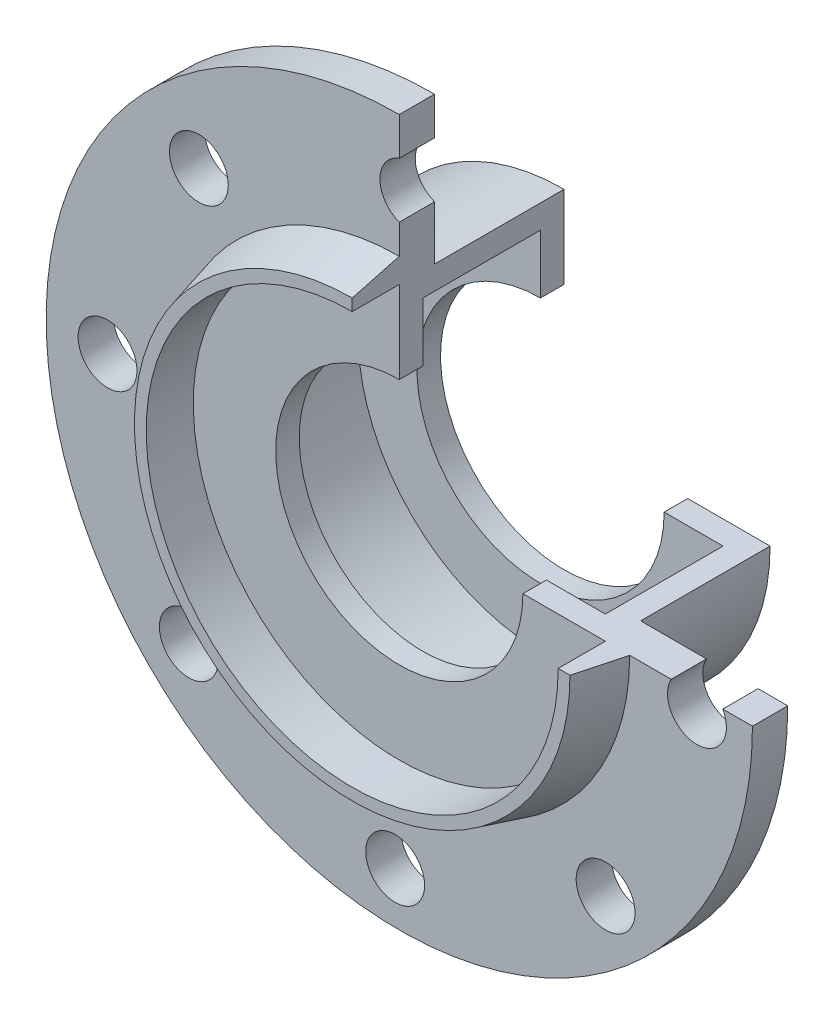
ISO-10303-21;
HEADER;
FILE_DESCRIPTION(('STEP AP214'),'2;1');
FILE_NAME('part.step','',(''),(''),'','','');
FILE_SCHEMA(('AUTOMOTIVE_DESIGN { 1 0 10303 214 1 1 1 1 }'));
ENDSEC;
DATA;
#1=APPLICATION_CONTEXT('core data for automotive mechanical design processes');
#2=APPLICATION_PROTOCOL_DEFINITION('international standard','automotive_design',2000,#1);
#3=PRODUCT_CONTEXT('',#1,'mechanical');
#4=PRODUCT('Part','Part','',(#3));
#5=PRODUCT_RELATED_PRODUCT_CATEGORY('part','',(#4));
#6=PRODUCT_DEFINITION_FORMATION('','',#4);
#7=PRODUCT_DEFINITION_CONTEXT('part definition',#1,'design');
#8=PRODUCT_DEFINITION('design','',#6,#7);
#9=PRODUCT_DEFINITION_SHAPE('','',#8);
#10=(LENGTH_UNIT() NAMED_UNIT(*) SI_UNIT(.MILLI.,.METRE.));
#11=(NAMED_UNIT(*) PLANE_ANGLE_UNIT() SI_UNIT($,.RADIAN.));
#12=(NAMED_UNIT(*) SI_UNIT($,.STERADIAN.) SOLID_ANGLE_UNIT());
#13=UNCERTAINTY_MEASURE_WITH_UNIT(LENGTH_MEASURE(1.E-05),#10,'distance_accuracy_value','');
#14=(GEOMETRIC_REPRESENTATION_CONTEXT(3) GLOBAL_UNCERTAINTY_ASSIGNED_CONTEXT((#13)) GLOBAL_UNIT_ASSIGNED_CONTEXT((#10,
#11,#12)) REPRESENTATION_CONTEXT('',''));
#15=CARTESIAN_POINT('',(0.,0.,0.));
#16=DIRECTION('',(0.,0.,1.));
#17=DIRECTION('',(1.,0.,0.));
#18=AXIS2_PLACEMENT_3D('',#15,#16,#17);
#19=CARTESIAN_POINT('',(35.,-34.9999999999997,0.));
#20=DIRECTION('',(0.,-1.,0.));
#21=DIRECTION('',(0.,0.,-1.));
#22=AXIS2_PLACEMENT_3D('',#19,#20,#21);
#23=PLANE('',#22);
#24=DIRECTION('',(1.,0.,0.));
#25=VECTOR('',#24,1.);
#26=CARTESIAN_POINT('',(60.,-34.9999999999994,-6.));
#27=LINE('',#26,#25);
#28=CARTESIAN_POINT('',(54.9503322412324,-34.9999999999994,-6.));
#29=VERTEX_POINT('',#28);
#30=CARTESIAN_POINT('',(60.,-34.9999999999994,-6.));
#31=VERTEX_POINT('',#30);
#32=EDGE_CURVE('E223',#29,#31,#27,.T.);
#33=ORIENTED_EDGE('',*,*,#32,.F.);
#34=DIRECTION('',(0.,0.,1.));
#35=VECTOR('',#34,1.);
#36=CARTESIAN_POINT('',(54.9503322412324,-34.9999999999994,-8.));
#37=LINE('',#36,#35);
#38=CARTESIAN_POINT('',(54.9503322412324,-34.9999999999994,0.));
#39=VERTEX_POINT('',#38);
#40=EDGE_CURVE('E11',#29,#39,#37,.T.);
#41=ORIENTED_EDGE('',*,*,#40,.T.);
#42=DIRECTION('',(-1.,0.,0.));
#43=VECTOR('',#42,1.);
#44=CARTESIAN_POINT('',(39.143593539449,-34.9999999999996,0.));
#45=LINE('',#44,#43);
#46=CARTESIAN_POINT('',(60.,-34.9999999999994,0.));
#47=VERTEX_POINT('',#46);
#48=EDGE_CURVE('E231',#47,#39,#45,.T.);
#49=ORIENTED_EDGE('',*,*,#48,.F.);
#50=DIRECTION('',(0.,0.,1.));
#51=VECTOR('',#50,1.);
#52=CARTESIAN_POINT('',(60.,-34.9999999999994,0.));
#53=LINE('',#52,#51);
#54=EDGE_CURVE('E227',#31,#47,#53,.T.);
#55=ORIENTED_EDGE('',*,*,#54,.F.);
#56=EDGE_LOOP('',(#33,#41,#49,#55));
#57=FACE_BOUND('',#56,.T.);
#58=ADVANCED_FACE('F39',(#57),#23,.F.);
#59=CARTESIAN_POINT('',(0.,0.,0.));
#60=DIRECTION('',(1.,0.,0.));
#61=DIRECTION('',(0.,0.,-1.));
#62=AXIS2_PLACEMENT_3D('',#59,#60,#61);
#63=PLANE('',#62);
#64=DIRECTION('',(0.,0.,1.));
#65=VECTOR('',#64,1.);
#66=CARTESIAN_POINT('',(0.,18.5642417158442,-8.));
#67=LINE('',#66,#65);
#68=CARTESIAN_POINT('',(0.,18.5642417158442,-6.));
#69=VERTEX_POINT('',#68);
#70=CARTESIAN_POINT('',(0.,18.5642417158442,0.));
#71=VERTEX_POINT('',#70);
#72=EDGE_CURVE('E162',#69,#71,#67,.T.);
#73=ORIENTED_EDGE('',*,*,#72,.F.);
#74=DIRECTION('',(0.,1.,0.));
#75=VECTOR('',#74,1.);
#76=CARTESIAN_POINT('',(0.,25.,-6.));
#77=LINE('',#76,#75);
#78=CARTESIAN_POINT('',(0.,25.,-6.));
#79=VERTEX_POINT('',#78);
#80=EDGE_CURVE('E377',#69,#79,#77,.T.);
#81=ORIENTED_EDGE('',*,*,#80,.T.);
#82=DIRECTION('',(0.,0.,1.));
#83=VECTOR('',#82,1.);
#84=CARTESIAN_POINT('',(0.,25.,0.));
#85=LINE('',#84,#83);
#86=CARTESIAN_POINT('',(0.,25.,0.));
#87=VERTEX_POINT('',#86);
#88=EDGE_CURVE('E185',#79,#87,#85,.T.);
#89=ORIENTED_EDGE('',*,*,#88,.T.);
#90=DIRECTION('',(0.,-1.,0.));
#91=VECTOR('',#90,1.);
#92=CARTESIAN_POINT('',(0.,4.14359353944899,0.));
#93=LINE('',#92,#91);
#94=EDGE_CURVE('E176',#87,#71,#93,.T.);
#95=ORIENTED_EDGE('',*,*,#94,.T.);
#96=EDGE_LOOP('',(#73,#81,#89,#95));
#97=FACE_BOUND('',#96,.T.);
#98=ADVANCED_FACE('F183',(#97),#63,.T.);
#99=CARTESIAN_POINT('',(21.,-34.9999999999998,0.));
#100=DIRECTION('',(0.,0.,1.));
#101=DIRECTION('',(1.,0.,0.));
#102=AXIS2_PLACEMENT_3D('',#99,#100,#101);
#103=PLANE('',#102);
#104=CARTESIAN_POINT('',(0.,-35.,0.));
#105=DIRECTION('',(0.,0.,-1.));
#106=DIRECTION('',(-1.,0.,0.));
#107=AXIS2_PLACEMENT_3D('',#104,#105,#106);
#108=CIRCLE('',#107,21.);
#109=CARTESIAN_POINT('',(21.,-34.9999999999998,0.));
#110=VERTEX_POINT('',#109);
#111=CARTESIAN_POINT('',(0.,-14.,0.));
#112=VERTEX_POINT('',#111);
#113=EDGE_CURVE('E270',#110,#112,#108,.T.);
#114=ORIENTED_EDGE('',*,*,#113,.T.);
#115=DIRECTION('',(0.,-1.,0.));
#116=VECTOR('',#115,1.);
#117=CARTESIAN_POINT('',(0.,-14.,0.));
#118=LINE('',#117,#116);
#119=CARTESIAN_POINT('',(0.,0.,0.));
#120=VERTEX_POINT('',#119);
#121=EDGE_CURVE('E365',#120,#112,#118,.T.);
#122=ORIENTED_EDGE('',*,*,#121,.F.);
#123=CARTESIAN_POINT('',(0.,-35.,0.));
#124=DIRECTION('',(0.,0.,-1.));
#125=DIRECTION('',(-1.,0.,0.));
#126=AXIS2_PLACEMENT_3D('',#123,#124,#125);
#127=CIRCLE('',#126,35.);
#128=CARTESIAN_POINT('',(35.,-34.9999999999997,0.));
#129=VERTEX_POINT('',#128);
#130=EDGE_CURVE('E243',#129,#120,#127,.T.);
#131=ORIENTED_EDGE('',*,*,#130,.F.);
#132=DIRECTION('',(-1.,0.,0.));
#133=VECTOR('',#132,1.);
#134=CARTESIAN_POINT('',(21.,-34.9999999999998,0.));
#135=LINE('',#134,#133);
#136=EDGE_CURVE('E199',#129,#110,#135,.T.);
#137=ORIENTED_EDGE('',*,*,#136,.T.);
#138=EDGE_LOOP('',(#114,#122,#131,#137));
#139=FACE_BOUND('',#138,.T.);
#140=ADVANCED_FACE('F403',(#139),#103,.T.);
#141=CARTESIAN_POINT('',(0.,-35.,7.99999999999999));
#142=DIRECTION('',(0.,0.,-1.));
#143=DIRECTION('',(-1.,0.,0.));
#144=AXIS2_PLACEMENT_3D('',#141,#142,#143);
#145=CYLINDRICAL_SURFACE('',#144,21.);
#146=CARTESIAN_POINT('',(0.,-35.,-4.));
#147=DIRECTION('',(0.,0.,-1.));
#148=DIRECTION('',(-1.,0.,0.));
#149=AXIS2_PLACEMENT_3D('',#146,#147,#148);
#150=CIRCLE('',#149,21.);
#151=CARTESIAN_POINT('',(21.,-34.9999999999998,-4.));
#152=VERTEX_POINT('',#151);
#153=CARTESIAN_POINT('',(0.,-14.,-4.));
#154=VERTEX_POINT('',#153);
#155=EDGE_CURVE('E268',#152,#154,#150,.T.);
#156=ORIENTED_EDGE('',*,*,#155,.T.);
#157=DIRECTION('',(0.,0.,-1.));
#158=VECTOR('',#157,1.);
#159=CARTESIAN_POINT('',(0.,-14.,-4.));
#160=LINE('',#159,#158);
#161=EDGE_CURVE('E368',#112,#154,#160,.T.);
#162=ORIENTED_EDGE('',*,*,#161,.F.);
#163=ORIENTED_EDGE('',*,*,#113,.F.);
#164=DIRECTION('',(0.,0.,-1.));
#165=VECTOR('',#164,1.);
#166=CARTESIAN_POINT('',(21.,-34.9999999999998,-4.));
#167=LINE('',#166,#165);
#168=EDGE_CURVE('E202',#110,#152,#167,.T.);
#169=ORIENTED_EDGE('',*,*,#168,.T.);
#170=EDGE_LOOP('',(#156,#162,#163,#169));
#171=FACE_BOUND('',#170,.T.);
#172=ADVANCED_FACE('F41',(#171),#145,.F.);
#173=CARTESIAN_POINT('',(31.,-34.9999999999997,-4.));
#174=DIRECTION('',(0.,0.,-1.));
#175=DIRECTION('',(-1.,0.,0.));
#176=AXIS2_PLACEMENT_3D('',#173,#174,#175);
#177=PLANE('',#176);
#178=CARTESIAN_POINT('',(0.,-35.,-4.));
#179=DIRECTION('',(0.,0.,-1.));
#180=DIRECTION('',(-1.,0.,0.));
#181=AXIS2_PLACEMENT_3D('',#178,#179,#180);
#182=CIRCLE('',#181,31.);
#183=CARTESIAN_POINT('',(31.,-34.9999999999997,-4.));
#184=VERTEX_POINT('',#183);
#185=CARTESIAN_POINT('',(0.,-4.,-4.));
#186=VERTEX_POINT('',#185);
#187=EDGE_CURVE('E266',#184,#186,#182,.T.);
#188=ORIENTED_EDGE('',*,*,#187,.T.);
#189=DIRECTION('',(0.,1.,0.));
#190=VECTOR('',#189,1.);
#191=CARTESIAN_POINT('',(0.,-4.,-4.));
#192=LINE('',#191,#190);
#193=EDGE_CURVE('E319',#154,#186,#192,.T.);
#194=ORIENTED_EDGE('',*,*,#193,.F.);
#195=ORIENTED_EDGE('',*,*,#155,.F.);
#196=DIRECTION('',(1.,0.,0.));
#197=VECTOR('',#196,1.);
#198=CARTESIAN_POINT('',(31.,-34.9999999999997,-4.));
#199=LINE('',#198,#197);
#200=EDGE_CURVE('E205',#152,#184,#199,.T.);
#201=ORIENTED_EDGE('',*,*,#200,.T.);
#202=EDGE_LOOP('',(#188,#194,#195,#201));
#203=FACE_BOUND('',#202,.T.);
#204=ADVANCED_FACE('F318',(#203),#177,.T.);
#205=CARTESIAN_POINT('',(0.,-35.,7.99999999999999));
#206=DIRECTION('',(0.,0.,-1.));
#207=DIRECTION('',(-1.,0.,0.));
#208=AXIS2_PLACEMENT_3D('',#205,#206,#207);
#209=CYLINDRICAL_SURFACE('',#208,31.);
#210=CARTESIAN_POINT('',(0.,-35.,-24.));
#211=DIRECTION('',(0.,0.,-1.));
#212=DIRECTION('',(-1.,0.,0.));
#213=AXIS2_PLACEMENT_3D('',#210,#211,#212);
#214=CIRCLE('',#213,31.);
#215=CARTESIAN_POINT('',(31.,-34.9999999999997,-24.));
#216=VERTEX_POINT('',#215);
#217=CARTESIAN_POINT('',(0.,-4.,-24.));
#218=VERTEX_POINT('',#217);
#219=EDGE_CURVE('E264',#216,#218,#214,.T.);
#220=ORIENTED_EDGE('',*,*,#219,.T.);
#221=DIRECTION('',(0.,0.,-1.));
#222=VECTOR('',#221,1.);
#223=CARTESIAN_POINT('',(0.,-4.,-24.));
#224=LINE('',#223,#222);
#225=EDGE_CURVE('E314',#186,#218,#224,.T.);
#226=ORIENTED_EDGE('',*,*,#225,.F.);
#227=ORIENTED_EDGE('',*,*,#187,.F.);
#228=DIRECTION('',(0.,0.,-1.));
#229=VECTOR('',#228,1.);
#230=CARTESIAN_POINT('',(31.,-34.9999999999997,-24.));
#231=LINE('',#230,#229);
#232=EDGE_CURVE('E208',#184,#216,#231,.T.);
#233=ORIENTED_EDGE('',*,*,#232,.T.);
#234=EDGE_LOOP('',(#220,#226,#227,#233));
#235=FACE_BOUND('',#234,.T.);
#236=ADVANCED_FACE('F311',(#235),#209,.F.);
#237=CARTESIAN_POINT('',(21.,-34.9999999999998,-24.));
#238=DIRECTION('',(0.,0.,1.));
#239=DIRECTION('',(1.,0.,0.));
#240=AXIS2_PLACEMENT_3D('',#237,#238,#239);
#241=PLANE('',#240);
#242=CARTESIAN_POINT('',(0.,-35.,-24.));
#243=DIRECTION('',(0.,0.,-1.));
#244=DIRECTION('',(-1.,0.,0.));
#245=AXIS2_PLACEMENT_3D('',#242,#243,#244);
#246=CIRCLE('',#245,21.);
#247=CARTESIAN_POINT('',(21.,-34.9999999999998,-24.));
#248=VERTEX_POINT('',#247);
#249=CARTESIAN_POINT('',(0.,-14.,-24.));
#250=VERTEX_POINT('',#249);
#251=EDGE_CURVE('E262',#248,#250,#246,.T.);
#252=ORIENTED_EDGE('',*,*,#251,.T.);
#253=DIRECTION('',(0.,-1.,0.));
#254=VECTOR('',#253,1.);
#255=CARTESIAN_POINT('',(0.,-14.,-24.));
#256=LINE('',#255,#254);
#257=EDGE_CURVE('E372',#218,#250,#256,.T.);
#258=ORIENTED_EDGE('',*,*,#257,.F.);
#259=ORIENTED_EDGE('',*,*,#219,.F.);
#260=DIRECTION('',(-1.,0.,0.));
#261=VECTOR('',#260,1.);
#262=CARTESIAN_POINT('',(21.,-34.9999999999998,-24.));
#263=LINE('',#262,#261);
#264=EDGE_CURVE('E211',#216,#248,#263,.T.);
#265=ORIENTED_EDGE('',*,*,#264,.T.);
#266=EDGE_LOOP('',(#252,#258,#259,#265));
#267=FACE_BOUND('',#266,.T.);
#268=ADVANCED_FACE('F306',(#267),#241,.T.);
#269=CARTESIAN_POINT('',(0.,-35.,7.99999999999999));
#270=DIRECTION('',(0.,0.,-1.));
#271=DIRECTION('',(-1.,0.,0.));
#272=AXIS2_PLACEMENT_3D('',#269,#270,#271);
#273=CYLINDRICAL_SURFACE('',#272,21.);
#274=CARTESIAN_POINT('',(0.,-35.,-28.));
#275=DIRECTION('',(0.,0.,-1.));
#276=DIRECTION('',(-1.,0.,0.));
#277=AXIS2_PLACEMENT_3D('',#274,#275,#276);
#278=CIRCLE('',#277,21.);
#279=CARTESIAN_POINT('',(21.,-34.9999999999998,-28.));
#280=VERTEX_POINT('',#279);
#281=CARTESIAN_POINT('',(0.,-14.,-28.));
#282=VERTEX_POINT('',#281);
#283=EDGE_CURVE('E260',#280,#282,#278,.T.);
#284=ORIENTED_EDGE('',*,*,#283,.T.);
#285=DIRECTION('',(0.,0.,-1.));
#286=VECTOR('',#285,1.);
#287=CARTESIAN_POINT('',(0.,-14.,-28.));
#288=LINE('',#287,#286);
#289=EDGE_CURVE('E302',#250,#282,#288,.T.);
#290=ORIENTED_EDGE('',*,*,#289,.F.);
#291=ORIENTED_EDGE('',*,*,#251,.F.);
#292=DIRECTION('',(0.,0.,-1.));
#293=VECTOR('',#292,1.);
#294=CARTESIAN_POINT('',(21.,-34.9999999999998,-28.));
#295=LINE('',#294,#293);
#296=EDGE_CURVE('E214',#248,#280,#295,.T.);
#297=ORIENTED_EDGE('',*,*,#296,.T.);
#298=EDGE_LOOP('',(#284,#290,#291,#297));
#299=FACE_BOUND('',#298,.T.);
#300=ADVANCED_FACE('F301',(#299),#273,.F.);
#301=CARTESIAN_POINT('',(35.,-34.9999999999997,-28.));
#302=DIRECTION('',(0.,0.,-1.));
#303=DIRECTION('',(-1.,0.,0.));
#304=AXIS2_PLACEMENT_3D('',#301,#302,#303);
#305=PLANE('',#304);
#306=CARTESIAN_POINT('',(0.,-35.,-28.));
#307=DIRECTION('',(0.,0.,-1.));
#308=DIRECTION('',(-1.,0.,0.));
#309=AXIS2_PLACEMENT_3D('',#306,#307,#308);
#310=CIRCLE('',#309,35.);
#311=CARTESIAN_POINT('',(35.,-34.9999999999997,-28.));
#312=VERTEX_POINT('',#311);
#313=CARTESIAN_POINT('',(0.,0.,-28.));
#314=VERTEX_POINT('',#313);
#315=EDGE_CURVE('E258',#312,#314,#310,.T.);
#316=ORIENTED_EDGE('',*,*,#315,.T.);
#317=DIRECTION('',(0.,1.,0.));
#318=VECTOR('',#317,1.);
#319=CARTESIAN_POINT('',(0.,0.,-28.));
#320=LINE('',#319,#318);
#321=EDGE_CURVE('E297',#282,#314,#320,.T.);
#322=ORIENTED_EDGE('',*,*,#321,.F.);
#323=ORIENTED_EDGE('',*,*,#283,.F.);
#324=DIRECTION('',(1.,0.,0.));
#325=VECTOR('',#324,1.);
#326=CARTESIAN_POINT('',(35.,-34.9999999999997,-28.));
#327=LINE('',#326,#325);
#328=EDGE_CURVE('E217',#280,#312,#327,.T.);
#329=ORIENTED_EDGE('',*,*,#328,.T.);
#330=EDGE_LOOP('',(#316,#322,#323,#329));
#331=FACE_BOUND('',#330,.T.);
#332=ADVANCED_FACE('F294',(#331),#305,.T.);
#333=CARTESIAN_POINT('',(0.,-35.,7.99999999999999));
#334=DIRECTION('',(0.,0.,-1.));
#335=DIRECTION('',(-1.,0.,0.));
#336=AXIS2_PLACEMENT_3D('',#333,#334,#335);
#337=CYLINDRICAL_SURFACE('',#336,35.);
#338=CARTESIAN_POINT('',(0.,-35.,-6.));
#339=DIRECTION('',(0.,0.,-1.));
#340=DIRECTION('',(-1.,0.,0.));
#341=AXIS2_PLACEMENT_3D('',#338,#339,#340);
#342=CIRCLE('',#341,35.);
#343=CARTESIAN_POINT('',(35.,-34.9999999999997,-6.));
#344=VERTEX_POINT('',#343);
#345=CARTESIAN_POINT('',(0.,0.,-6.));
#346=VERTEX_POINT('',#345);
#347=EDGE_CURVE('E256',#344,#346,#342,.T.);
#348=ORIENTED_EDGE('',*,*,#347,.T.);
#349=DIRECTION('',(0.,0.,1.));
#350=VECTOR('',#349,1.);
#351=CARTESIAN_POINT('',(0.,0.,-6.));
#352=LINE('',#351,#350);
#353=EDGE_CURVE('E376',#314,#346,#352,.T.);
#354=ORIENTED_EDGE('',*,*,#353,.F.);
#355=ORIENTED_EDGE('',*,*,#315,.F.);
#356=DIRECTION('',(0.,0.,1.));
#357=VECTOR('',#356,1.);
#358=CARTESIAN_POINT('',(35.,-34.9999999999997,-6.));
#359=LINE('',#358,#357);
#360=EDGE_CURVE('E220',#312,#344,#359,.T.);
#361=ORIENTED_EDGE('',*,*,#360,.T.);
#362=EDGE_LOOP('',(#348,#354,#355,#361));
#363=FACE_BOUND('',#362,.T.);
#364=ADVANCED_FACE('F289',(#363),#337,.T.);
#365=CARTESIAN_POINT('',(60.,-34.9999999999994,-6.));
#366=DIRECTION('',(0.,0.,-1.));
#367=DIRECTION('',(-1.,0.,0.));
#368=AXIS2_PLACEMENT_3D('',#365,#366,#367);
#369=PLANE('',#368);
#370=CARTESIAN_POINT('',(1.70710678118665,13.8646899885381,-6.));
#371=DIRECTION('',(0.,0.,-1.));
#372=DIRECTION('',(-1.,0.,0.));
#373=AXIS2_PLACEMENT_3D('',#370,#371,#372);
#374=CIRCLE('',#373,5.);
#375=CARTESIAN_POINT('',(0.,9.16513826123188,-6.));
#376=VERTEX_POINT('',#375);
#377=EDGE_CURVE('E165',#376,#69,#374,.T.);
#378=ORIENTED_EDGE('',*,*,#377,.F.);
#379=EDGE_CURVE('E285',#346,#376,#77,.T.);
#380=ORIENTED_EDGE('',*,*,#379,.F.);
#381=ORIENTED_EDGE('',*,*,#347,.F.);
#382=CARTESIAN_POINT('',(46.193261298217,-34.9999999999995,-6.));
#383=VERTEX_POINT('',#382);
#384=EDGE_CURVE('E224',#344,#383,#27,.T.);
#385=ORIENTED_EDGE('',*,*,#384,.T.);
#386=CARTESIAN_POINT('',(50.5717967697247,-37.4142135623731,-6.));
#387=DIRECTION('',(0.,0.,-1.));
#388=DIRECTION('',(-1.,0.,0.));
#389=AXIS2_PLACEMENT_3D('',#386,#387,#388);
#390=CIRCLE('',#389,5.);
#391=EDGE_CURVE('E54',#29,#383,#390,.T.);
#392=ORIENTED_EDGE('',*,*,#391,.F.);
#393=ORIENTED_EDGE('',*,*,#32,.T.);
#394=CARTESIAN_POINT('',(0.,-35.,-6.));
#395=DIRECTION('',(0.,0.,-1.));
#396=DIRECTION('',(-1.,0.,0.));
#397=AXIS2_PLACEMENT_3D('',#394,#395,#396);
#398=CIRCLE('',#397,60.);
#399=EDGE_CURVE('E253',#31,#79,#398,.T.);
#400=ORIENTED_EDGE('',*,*,#399,.T.);
#401=ORIENTED_EDGE('',*,*,#80,.F.);
#402=EDGE_LOOP('',(#378,#380,#381,#385,#392,#393,#400,#401));
#403=FACE_BOUND('',#402,.T.);
#404=CARTESIAN_POINT('',(35.0525536514738,-72.4667672138468,-6.));
#405=DIRECTION('',(0.,0.,-1.));
#406=DIRECTION('',(-1.,0.,0.));
#407=AXIS2_PLACEMENT_3D('',#404,#405,#406);
#408=CIRCLE('',#407,5.);
#409=CARTESIAN_POINT('',(30.0525536514738,-72.4667672138468,-6.));
#410=VERTEX_POINT('',#409);
#411=EDGE_CURVE('E362',#410,#410,#408,.T.);
#412=ORIENTED_EDGE('',*,*,#411,.F.);
#413=EDGE_LOOP('',(#412));
#414=FACE_BOUND('',#413,.T.);
#415=CARTESIAN_POINT('',(-0.70710678118642,-86.2789035509112,-6.));
#416=DIRECTION('',(0.,0.,-1.));
#417=DIRECTION('',(-1.,0.,0.));
#418=AXIS2_PLACEMENT_3D('',#415,#416,#417);
#419=CIRCLE('',#418,5.);
#420=CARTESIAN_POINT('',(-5.70710678118642,-86.2789035509112,-6.));
#421=VERTEX_POINT('',#420);
#422=EDGE_CURVE('E359',#421,#421,#419,.T.);
#423=ORIENTED_EDGE('',*,*,#422,.F.);
#424=EDGE_LOOP('',(#423));
#425=FACE_BOUND('',#424,.T.);
#426=CARTESIAN_POINT('',(-35.7596604326601,-70.7596604326602,-6.));
#427=DIRECTION('',(0.,0.,-1.));
#428=DIRECTION('',(-1.,0.,0.));
#429=AXIS2_PLACEMENT_3D('',#426,#427,#428);
#430=CIRCLE('',#429,5.00000000000001);
#431=CARTESIAN_POINT('',(-40.7596604326601,-70.7596604326602,-6.));
#432=VERTEX_POINT('',#431);
#433=EDGE_CURVE('E356',#432,#432,#430,.T.);
#434=ORIENTED_EDGE('',*,*,#433,.F.);
#435=EDGE_LOOP('',(#434));
#436=FACE_BOUND('',#435,.T.);
#437=CARTESIAN_POINT('',(-49.5717967697245,-35.,-6.));
#438=DIRECTION('',(0.,0.,-1.));
#439=DIRECTION('',(-1.,0.,0.));
#440=AXIS2_PLACEMENT_3D('',#437,#438,#439);
#441=CIRCLE('',#440,5.);
#442=CARTESIAN_POINT('',(-54.5717967697245,-35.,-6.));
#443=VERTEX_POINT('',#442);
#444=EDGE_CURVE('E353',#443,#443,#441,.T.);
#445=ORIENTED_EDGE('',*,*,#444,.F.);
#446=EDGE_LOOP('',(#445));
#447=FACE_BOUND('',#446,.T.);
#448=CARTESIAN_POINT('',(-34.0525536514736,0.0525536514736497,-6.));
#449=DIRECTION('',(0.,0.,-1.));
#450=DIRECTION('',(-1.,0.,0.));
#451=AXIS2_PLACEMENT_3D('',#448,#449,#450);
#452=CIRCLE('',#451,5.);
#453=CARTESIAN_POINT('',(-39.0525536514736,0.0525536514736497,-6.));
#454=VERTEX_POINT('',#453);
#455=EDGE_CURVE('E350',#454,#454,#452,.T.);
#456=ORIENTED_EDGE('',*,*,#455,.F.);
#457=EDGE_LOOP('',(#456));
#458=FACE_BOUND('',#457,.T.);
#459=ADVANCED_FACE('F280',(#403,#414,#425,#436,#447,#458),#369,.T.);
#460=CARTESIAN_POINT('',(0.,-35.,7.99999999999999));
#461=DIRECTION('',(0.,0.,-1.));
#462=DIRECTION('',(-1.,0.,0.));
#463=AXIS2_PLACEMENT_3D('',#460,#461,#462);
#464=CYLINDRICAL_SURFACE('',#463,60.);
#465=CARTESIAN_POINT('',(0.,-35.,0.));
#466=DIRECTION('',(0.,0.,-1.));
#467=DIRECTION('',(-1.,0.,0.));
#468=AXIS2_PLACEMENT_3D('',#465,#466,#467);
#469=CIRCLE('',#468,60.);
#470=EDGE_CURVE('E251',#47,#87,#469,.T.);
#471=ORIENTED_EDGE('',*,*,#470,.T.);
#472=ORIENTED_EDGE('',*,*,#88,.F.);
#473=ORIENTED_EDGE('',*,*,#399,.F.);
#474=ORIENTED_EDGE('',*,*,#54,.T.);
#475=EDGE_LOOP('',(#471,#472,#473,#474));
#476=FACE_BOUND('',#475,.T.);
#477=ADVANCED_FACE('F382',(#476),#464,.T.);
#478=CARTESIAN_POINT('',(39.143593539449,-34.9999999999996,0.));
#479=DIRECTION('',(0.,0.,1.));
#480=DIRECTION('',(1.,0.,0.));
#481=AXIS2_PLACEMENT_3D('',#478,#479,#480);
#482=PLANE('',#481);
#483=CARTESIAN_POINT('',(1.70710678118665,13.8646899885381,0.));
#484=DIRECTION('',(0.,0.,1.));
#485=DIRECTION('',(1.,0.,0.));
#486=AXIS2_PLACEMENT_3D('',#483,#484,#485);
#487=CIRCLE('',#486,5.);
#488=CARTESIAN_POINT('',(0.,9.16513826123188,0.));
#489=VERTEX_POINT('',#488);
#490=EDGE_CURVE('E62',#71,#489,#487,.T.);
#491=ORIENTED_EDGE('',*,*,#490,.F.);
#492=ORIENTED_EDGE('',*,*,#94,.F.);
#493=ORIENTED_EDGE('',*,*,#470,.F.);
#494=ORIENTED_EDGE('',*,*,#48,.T.);
#495=CARTESIAN_POINT('',(50.5717967697247,-37.4142135623731,0.));
#496=DIRECTION('',(0.,0.,1.));
#497=DIRECTION('',(1.,0.,0.));
#498=AXIS2_PLACEMENT_3D('',#495,#496,#497);
#499=CIRCLE('',#498,5.);
#500=CARTESIAN_POINT('',(46.193261298217,-34.9999999999995,0.));
#501=VERTEX_POINT('',#500);
#502=EDGE_CURVE('E180',#501,#39,#499,.T.);
#503=ORIENTED_EDGE('',*,*,#502,.F.);
#504=CARTESIAN_POINT('',(39.143593539449,-34.9999999999996,0.));
#505=VERTEX_POINT('',#504);
#506=EDGE_CURVE('E230',#501,#505,#45,.T.);
#507=ORIENTED_EDGE('',*,*,#506,.T.);
#508=CARTESIAN_POINT('',(0.,-35.,0.));
#509=DIRECTION('',(0.,0.,-1.));
#510=DIRECTION('',(-1.,0.,0.));
#511=AXIS2_PLACEMENT_3D('',#508,#509,#510);
#512=CIRCLE('',#511,39.143593539449);
#513=CARTESIAN_POINT('',(0.,4.14359353944899,0.));
#514=VERTEX_POINT('',#513);
#515=EDGE_CURVE('E249',#505,#514,#512,.T.);
#516=ORIENTED_EDGE('',*,*,#515,.T.);
#517=EDGE_CURVE('E178',#489,#514,#93,.T.);
#518=ORIENTED_EDGE('',*,*,#517,.F.);
#519=EDGE_LOOP('',(#491,#492,#493,#494,#503,#507,#516,#518));
#520=FACE_BOUND('',#519,.T.);
#521=CARTESIAN_POINT('',(35.0525536514738,-72.4667672138468,0.));
#522=DIRECTION('',(0.,0.,1.));
#523=DIRECTION('',(1.,0.,0.));
#524=AXIS2_PLACEMENT_3D('',#521,#522,#523);
#525=CIRCLE('',#524,5.);
#526=CARTESIAN_POINT('',(40.0525536514738,-72.4667672138468,0.));
#527=VERTEX_POINT('',#526);
#528=EDGE_CURVE('E339',#527,#527,#525,.T.);
#529=ORIENTED_EDGE('',*,*,#528,.F.);
#530=EDGE_LOOP('',(#529));
#531=FACE_BOUND('',#530,.T.);
#532=CARTESIAN_POINT('',(-0.70710678118642,-86.2789035509112,0.));
#533=DIRECTION('',(0.,0.,1.));
#534=DIRECTION('',(1.,0.,0.));
#535=AXIS2_PLACEMENT_3D('',#532,#533,#534);
#536=CIRCLE('',#535,5.);
#537=CARTESIAN_POINT('',(4.29289321881358,-86.2789035509112,0.));
#538=VERTEX_POINT('',#537);
#539=EDGE_CURVE('E342',#538,#538,#536,.T.);
#540=ORIENTED_EDGE('',*,*,#539,.F.);
#541=EDGE_LOOP('',(#540));
#542=FACE_BOUND('',#541,.T.);
#543=CARTESIAN_POINT('',(-35.7596604326601,-70.7596604326602,0.));
#544=DIRECTION('',(0.,0.,1.));
#545=DIRECTION('',(1.,0.,0.));
#546=AXIS2_PLACEMENT_3D('',#543,#544,#545);
#547=CIRCLE('',#546,5.00000000000001);
#548=CARTESIAN_POINT('',(-30.7596604326601,-70.7596604326602,0.));
#549=VERTEX_POINT('',#548);
#550=EDGE_CURVE('E567',#549,#549,#547,.T.);
#551=ORIENTED_EDGE('',*,*,#550,.F.);
#552=EDGE_LOOP('',(#551));
#553=FACE_BOUND('',#552,.T.);
#554=CARTESIAN_POINT('',(-49.5717967697245,-35.,0.));
#555=DIRECTION('',(0.,0.,1.));
#556=DIRECTION('',(1.,0.,0.));
#557=AXIS2_PLACEMENT_3D('',#554,#555,#556);
#558=CIRCLE('',#557,5.);
#559=CARTESIAN_POINT('',(-44.5717967697245,-35.,0.));
#560=VERTEX_POINT('',#559);
#561=EDGE_CURVE('E571',#560,#560,#558,.T.);
#562=ORIENTED_EDGE('',*,*,#561,.F.);
#563=EDGE_LOOP('',(#562));
#564=FACE_BOUND('',#563,.T.);
#565=CARTESIAN_POINT('',(-34.0525536514736,0.0525536514736497,0.));
#566=DIRECTION('',(0.,0.,1.));
#567=DIRECTION('',(1.,0.,0.));
#568=AXIS2_PLACEMENT_3D('',#565,#566,#567);
#569=CIRCLE('',#568,5.);
#570=CARTESIAN_POINT('',(-29.0525536514736,0.0525536514736497,0.));
#571=VERTEX_POINT('',#570);
#572=EDGE_CURVE('E179',#571,#571,#569,.T.);
#573=ORIENTED_EDGE('',*,*,#572,.F.);
#574=EDGE_LOOP('',(#573));
#575=FACE_BOUND('',#574,.T.);
#576=ADVANCED_FACE('F174',(#520,#531,#542,#553,#564,#575),#482,.T.);
#577=CARTESIAN_POINT('',(0.,-35.,0.));
#578=DIRECTION('',(0.,0.,-1.));
#579=DIRECTION('',(-1.,0.,0.));
#580=AXIS2_PLACEMENT_3D('',#577,#578,#579);
#581=CONICAL_SURFACE('',#580,39.143593539449,0.26179938779915);
#582=CARTESIAN_POINT('',(0.,-35.,8.));
#583=DIRECTION('',(0.,0.,-1.));
#584=DIRECTION('',(-1.,0.,0.));
#585=AXIS2_PLACEMENT_3D('',#582,#583,#584);
#586=CIRCLE('',#585,37.);
#587=CARTESIAN_POINT('',(37.,-34.9999999999996,8.));
#588=VERTEX_POINT('',#587);
#589=CARTESIAN_POINT('',(0.,2.,8.));
#590=VERTEX_POINT('',#589);
#591=EDGE_CURVE('E247',#588,#590,#586,.T.);
#592=ORIENTED_EDGE('',*,*,#591,.T.);
#593=DIRECTION('',(0.,-0.258819045102522,0.965925826289068));
#594=VECTOR('',#593,1.);
#595=CARTESIAN_POINT('',(0.,2.,8.));
#596=LINE('',#595,#594);
#597=EDGE_CURVE('E186',#514,#590,#596,.T.);
#598=ORIENTED_EDGE('',*,*,#597,.F.);
#599=ORIENTED_EDGE('',*,*,#515,.F.);
#600=DIRECTION('',(-0.258819045102522,0.,0.965925826289068));
#601=VECTOR('',#600,1.);
#602=CARTESIAN_POINT('',(37.,-34.9999999999996,8.));
#603=LINE('',#602,#601);
#604=EDGE_CURVE('E234',#505,#588,#603,.T.);
#605=ORIENTED_EDGE('',*,*,#604,.T.);
#606=EDGE_LOOP('',(#592,#598,#599,#605));
#607=FACE_BOUND('',#606,.T.);
#608=ADVANCED_FACE('F336',(#607),#581,.T.);
#609=CARTESIAN_POINT('',(35.,-34.9999999999997,7.99999999999999));
#610=DIRECTION('',(0.,0.,1.));
#611=DIRECTION('',(1.,0.,0.));
#612=AXIS2_PLACEMENT_3D('',#609,#610,#611);
#613=PLANE('',#612);
#614=CARTESIAN_POINT('',(0.,-35.,7.99999999999999));
#615=DIRECTION('',(0.,0.,-1.));
#616=DIRECTION('',(-1.,0.,0.));
#617=AXIS2_PLACEMENT_3D('',#614,#615,#616);
#618=CIRCLE('',#617,35.);
#619=CARTESIAN_POINT('',(35.,-34.9999999999997,7.99999999999999));
#620=VERTEX_POINT('',#619);
#621=CARTESIAN_POINT('',(0.,0.,7.99999999999999));
#622=VERTEX_POINT('',#621);
#623=EDGE_CURVE('E245',#620,#622,#618,.T.);
#624=ORIENTED_EDGE('',*,*,#623,.T.);
#625=DIRECTION('',(0.,-1.,0.));
#626=VECTOR('',#625,1.);
#627=CARTESIAN_POINT('',(0.,0.,7.99999999999999));
#628=LINE('',#627,#626);
#629=EDGE_CURVE('E189',#590,#622,#628,.T.);
#630=ORIENTED_EDGE('',*,*,#629,.F.);
#631=ORIENTED_EDGE('',*,*,#591,.F.);
#632=DIRECTION('',(-1.,0.,0.));
#633=VECTOR('',#632,1.);
#634=CARTESIAN_POINT('',(35.,-34.9999999999997,7.99999999999999));
#635=LINE('',#634,#633);
#636=EDGE_CURVE('E237',#588,#620,#635,.T.);
#637=ORIENTED_EDGE('',*,*,#636,.T.);
#638=EDGE_LOOP('',(#624,#630,#631,#637));
#639=FACE_BOUND('',#638,.T.);
#640=ADVANCED_FACE('F333',(#639),#613,.T.);
#641=CARTESIAN_POINT('',(0.,-35.,7.99999999999999));
#642=DIRECTION('',(0.,0.,-1.));
#643=DIRECTION('',(-1.,0.,0.));
#644=AXIS2_PLACEMENT_3D('',#641,#642,#643);
#645=CYLINDRICAL_SURFACE('',#644,35.);
#646=DIRECTION('',(0.,0.,-1.));
#647=VECTOR('',#646,1.);
#648=CARTESIAN_POINT('',(35.,-34.9999999999997,0.));
#649=LINE('',#648,#647);
#650=EDGE_CURVE('E240',#620,#129,#649,.T.);
#651=ORIENTED_EDGE('',*,*,#650,.T.);
#652=ORIENTED_EDGE('',*,*,#130,.T.);
#653=DIRECTION('',(0.,0.,-1.));
#654=VECTOR('',#653,1.);
#655=CARTESIAN_POINT('',(0.,0.,0.));
#656=LINE('',#655,#654);
#657=EDGE_CURVE('E196',#622,#120,#656,.T.);
#658=ORIENTED_EDGE('',*,*,#657,.F.);
#659=ORIENTED_EDGE('',*,*,#623,.F.);
#660=EDGE_LOOP('',(#651,#652,#658,#659));
#661=FACE_BOUND('',#660,.T.);
#662=ADVANCED_FACE('F328',(#661),#645,.F.);
#663=ORIENTED_EDGE('',*,*,#506,.F.);
#664=DIRECTION('',(0.,0.,1.));
#665=VECTOR('',#664,1.);
#666=CARTESIAN_POINT('',(46.193261298217,-34.9999999999995,-8.));
#667=LINE('',#666,#665);
#668=EDGE_CURVE('E47',#501,#383,#667,.F.);
#669=ORIENTED_EDGE('',*,*,#668,.T.);
#670=ORIENTED_EDGE('',*,*,#384,.F.);
#671=ORIENTED_EDGE('',*,*,#360,.F.);
#672=ORIENTED_EDGE('',*,*,#328,.F.);
#673=ORIENTED_EDGE('',*,*,#296,.F.);
#674=ORIENTED_EDGE('',*,*,#264,.F.);
#675=ORIENTED_EDGE('',*,*,#232,.F.);
#676=ORIENTED_EDGE('',*,*,#200,.F.);
#677=ORIENTED_EDGE('',*,*,#168,.F.);
#678=ORIENTED_EDGE('',*,*,#136,.F.);
#679=ORIENTED_EDGE('',*,*,#650,.F.);
#680=ORIENTED_EDGE('',*,*,#636,.F.);
#681=ORIENTED_EDGE('',*,*,#604,.F.);
#682=EDGE_LOOP('',(#663,#669,#670,#671,#672,#673,#674,#675,#676,#677,#678,#679,#680,#681));
#683=FACE_BOUND('',#682,.T.);
#684=ADVANCED_FACE('F275',(#683),#23,.F.);
#685=DIRECTION('',(0.,0.,1.));
#686=VECTOR('',#685,1.);
#687=CARTESIAN_POINT('',(0.,9.16513826123188,-8.));
#688=LINE('',#687,#686);
#689=EDGE_CURVE('E169',#489,#376,#688,.F.);
#690=ORIENTED_EDGE('',*,*,#689,.F.);
#691=ORIENTED_EDGE('',*,*,#517,.T.);
#692=ORIENTED_EDGE('',*,*,#597,.T.);
#693=ORIENTED_EDGE('',*,*,#629,.T.);
#694=ORIENTED_EDGE('',*,*,#657,.T.);
#695=ORIENTED_EDGE('',*,*,#121,.T.);
#696=ORIENTED_EDGE('',*,*,#161,.T.);
#697=ORIENTED_EDGE('',*,*,#193,.T.);
#698=ORIENTED_EDGE('',*,*,#225,.T.);
#699=ORIENTED_EDGE('',*,*,#257,.T.);
#700=ORIENTED_EDGE('',*,*,#289,.T.);
#701=ORIENTED_EDGE('',*,*,#321,.T.);
#702=ORIENTED_EDGE('',*,*,#353,.T.);
#703=ORIENTED_EDGE('',*,*,#379,.T.);
#704=EDGE_LOOP('',(#690,#691,#692,#693,#694,#695,#696,#697,#698,#699,#700,#701,#702,#703));
#705=FACE_BOUND('',#704,.T.);
#706=ADVANCED_FACE('F395',(#705),#63,.T.);
#707=CARTESIAN_POINT('',(1.70710678118665,13.8646899885381,-8.));
#708=DIRECTION('',(0.,0.,1.));
#709=DIRECTION('',(1.,0.,0.));
#710=AXIS2_PLACEMENT_3D('',#707,#708,#709);
#711=CYLINDRICAL_SURFACE('',#710,5.);
#712=ORIENTED_EDGE('',*,*,#72,.T.);
#713=ORIENTED_EDGE('',*,*,#490,.T.);
#714=ORIENTED_EDGE('',*,*,#689,.T.);
#715=ORIENTED_EDGE('',*,*,#377,.T.);
#716=EDGE_LOOP('',(#712,#713,#714,#715));
#717=FACE_BOUND('',#716,.T.);
#718=ADVANCED_FACE('F163',(#717),#711,.F.);
#719=CARTESIAN_POINT('',(50.5717967697247,-37.4142135623731,-8.));
#720=DIRECTION('',(0.,0.,1.));
#721=DIRECTION('',(1.,0.,0.));
#722=AXIS2_PLACEMENT_3D('',#719,#720,#721);
#723=CYLINDRICAL_SURFACE('',#722,5.);
#724=ORIENTED_EDGE('',*,*,#391,.T.);
#725=ORIENTED_EDGE('',*,*,#668,.F.);
#726=ORIENTED_EDGE('',*,*,#502,.T.);
#727=ORIENTED_EDGE('',*,*,#40,.F.);
#728=EDGE_LOOP('',(#724,#725,#726,#727));
#729=FACE_BOUND('',#728,.T.);
#730=ADVANCED_FACE('F384',(#729),#723,.F.);
#731=CARTESIAN_POINT('',(-34.0525536514736,0.0525536514736497,-8.));
#732=DIRECTION('',(0.,0.,1.));
#733=DIRECTION('',(1.,0.,0.));
#734=AXIS2_PLACEMENT_3D('',#731,#732,#733);
#735=CYLINDRICAL_SURFACE('',#734,5.);
#736=ORIENTED_EDGE('',*,*,#455,.T.);
#737=EDGE_LOOP('',(#736));
#738=FACE_BOUND('',#737,.T.);
#739=ORIENTED_EDGE('',*,*,#572,.T.);
#740=EDGE_LOOP('',(#739));
#741=FACE_BOUND('',#740,.T.);
#742=ADVANCED_FACE('F386',(#738,#741),#735,.F.);
#743=CARTESIAN_POINT('',(-49.5717967697245,-35.,-8.));
#744=DIRECTION('',(0.,0.,1.));
#745=DIRECTION('',(1.,0.,0.));
#746=AXIS2_PLACEMENT_3D('',#743,#744,#745);
#747=CYLINDRICAL_SURFACE('',#746,5.);
#748=ORIENTED_EDGE('',*,*,#444,.T.);
#749=EDGE_LOOP('',(#748));
#750=FACE_BOUND('',#749,.T.);
#751=ORIENTED_EDGE('',*,*,#561,.T.);
#752=EDGE_LOOP('',(#751));
#753=FACE_BOUND('',#752,.T.);
#754=ADVANCED_FACE('F392',(#750,#753),#747,.F.);
#755=CARTESIAN_POINT('',(-35.7596604326601,-70.7596604326602,-8.));
#756=DIRECTION('',(0.,0.,1.));
#757=DIRECTION('',(1.,0.,0.));
#758=AXIS2_PLACEMENT_3D('',#755,#756,#757);
#759=CYLINDRICAL_SURFACE('',#758,5.00000000000001);
#760=ORIENTED_EDGE('',*,*,#433,.T.);
#761=EDGE_LOOP('',(#760));
#762=FACE_BOUND('',#761,.T.);
#763=ORIENTED_EDGE('',*,*,#550,.T.);
#764=EDGE_LOOP('',(#763));
#765=FACE_BOUND('',#764,.T.);
#766=ADVANCED_FACE('F508',(#762,#765),#759,.F.);
#767=CARTESIAN_POINT('',(-0.70710678118642,-86.2789035509112,-8.));
#768=DIRECTION('',(0.,0.,1.));
#769=DIRECTION('',(1.,0.,0.));
#770=AXIS2_PLACEMENT_3D('',#767,#768,#769);
#771=CYLINDRICAL_SURFACE('',#770,5.);
#772=ORIENTED_EDGE('',*,*,#422,.T.);
#773=EDGE_LOOP('',(#772));
#774=FACE_BOUND('',#773,.T.);
#775=ORIENTED_EDGE('',*,*,#539,.T.);
#776=EDGE_LOOP('',(#775));
#777=FACE_BOUND('',#776,.T.);
#778=ADVANCED_FACE('F519',(#774,#777),#771,.F.);
#779=CARTESIAN_POINT('',(35.0525536514738,-72.4667672138468,-8.));
#780=DIRECTION('',(0.,0.,1.));
#781=DIRECTION('',(1.,0.,0.));
#782=AXIS2_PLACEMENT_3D('',#779,#780,#781);
#783=CYLINDRICAL_SURFACE('',#782,5.);
#784=ORIENTED_EDGE('',*,*,#411,.T.);
#785=EDGE_LOOP('',(#784));
#786=FACE_BOUND('',#785,.T.);
#787=ORIENTED_EDGE('',*,*,#528,.T.);
#788=EDGE_LOOP('',(#787));
#789=FACE_BOUND('',#788,.T.);
#790=ADVANCED_FACE('F530',(#786,#789),#783,.F.);
#791=CLOSED_SHELL('',(#58,#98,#140,#172,#204,#236,#268,#300,#332,#364,#459,#477,#576,#608,#640,
#662,#684,#706,#718,#730,#742,#754,#766,#778,#790));
#792=MANIFOLD_SOLID_BREP('B2',#791);
#793=ADVANCED_BREP_SHAPE_REPRESENTATION('',(#18,#792),#14);
#794=SHAPE_DEFINITION_REPRESENTATION(#9,#793);
ENDSEC;
END-ISO-10303-21;
